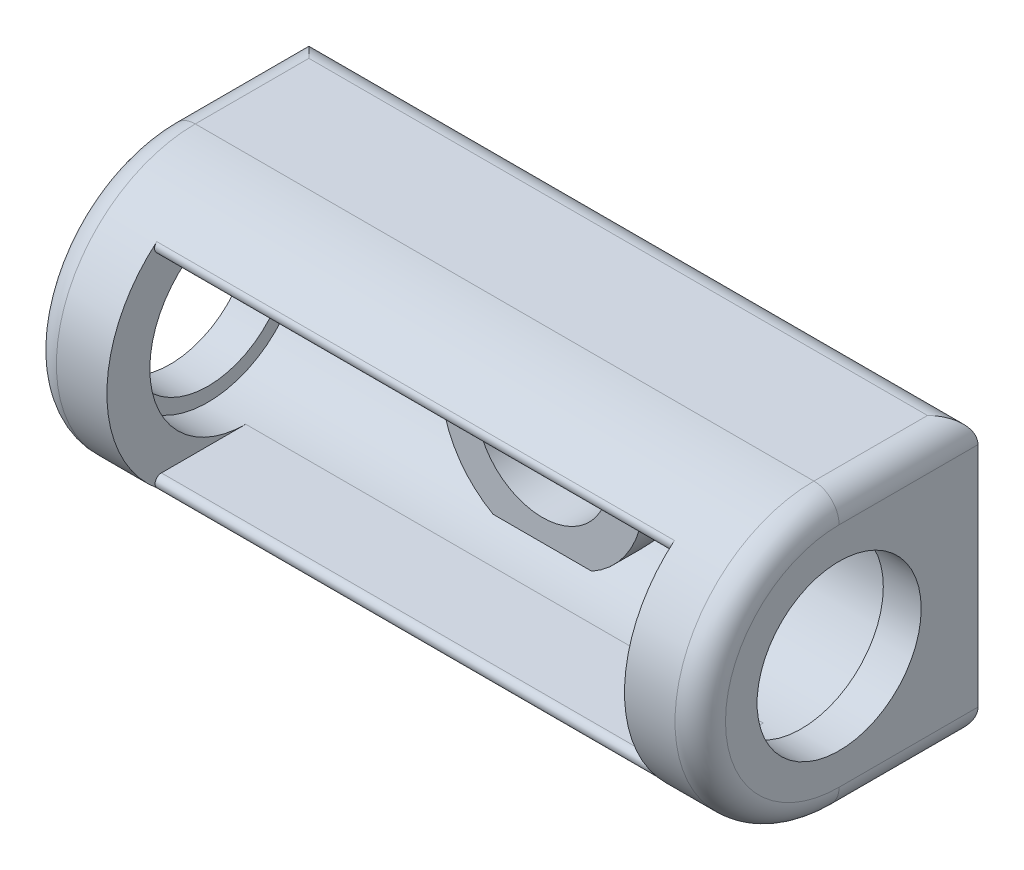
ISO-10303-21;
HEADER;
FILE_DESCRIPTION(('STEP AP214'),'2;1');
FILE_NAME('part.step','',(''),(''),'','','');
FILE_SCHEMA(('AUTOMOTIVE_DESIGN { 1 0 10303 214 1 1 1 1 }'));
ENDSEC;
DATA;
#1=APPLICATION_CONTEXT('core data for automotive mechanical design processes');
#2=APPLICATION_PROTOCOL_DEFINITION('international standard','automotive_design',2000,#1);
#3=PRODUCT_CONTEXT('',#1,'mechanical');
#4=PRODUCT('Part','Part','',(#3));
#5=PRODUCT_RELATED_PRODUCT_CATEGORY('part','',(#4));
#6=PRODUCT_DEFINITION_FORMATION('','',#4);
#7=PRODUCT_DEFINITION_CONTEXT('part definition',#1,'design');
#8=PRODUCT_DEFINITION('design','',#6,#7);
#9=PRODUCT_DEFINITION_SHAPE('','',#8);
#10=(LENGTH_UNIT() NAMED_UNIT(*) SI_UNIT(.MILLI.,.METRE.));
#11=(NAMED_UNIT(*) PLANE_ANGLE_UNIT() SI_UNIT($,.RADIAN.));
#12=(NAMED_UNIT(*) SI_UNIT($,.STERADIAN.) SOLID_ANGLE_UNIT());
#13=UNCERTAINTY_MEASURE_WITH_UNIT(LENGTH_MEASURE(1.E-05),#10,'distance_accuracy_value','');
#14=(GEOMETRIC_REPRESENTATION_CONTEXT(3) GLOBAL_UNCERTAINTY_ASSIGNED_CONTEXT((#13)) GLOBAL_UNIT_ASSIGNED_CONTEXT((#10,
#11,#12)) REPRESENTATION_CONTEXT('',''));
#15=CARTESIAN_POINT('',(0.,0.,0.));
#16=DIRECTION('',(0.,0.,1.));
#17=DIRECTION('',(1.,0.,0.));
#18=AXIS2_PLACEMENT_3D('',#15,#16,#17);
#19=CARTESIAN_POINT('',(47.,0.,0.));
#20=DIRECTION('',(-1.,0.,0.));
#21=DIRECTION('',(0.,0.,-1.));
#22=AXIS2_PLACEMENT_3D('',#19,#20,#21);
#23=PLANE('',#22);
#24=CARTESIAN_POINT('',(47.,0.,0.));
#25=DIRECTION('',(-1.,0.,0.));
#26=DIRECTION('',(0.,0.,1.));
#27=AXIS2_PLACEMENT_3D('',#24,#25,#26);
#28=CIRCLE('',#27,11.);
#29=CARTESIAN_POINT('',(47.,8.44769069068865,7.04531915490365));
#30=VERTEX_POINT('',#29);
#31=CARTESIAN_POINT('',(47.,-8.48571428571428,6.99947519898631));
#32=VERTEX_POINT('',#31);
#33=EDGE_CURVE('E414',#30,#32,#28,.F.);
#34=ORIENTED_EDGE('',*,*,#33,.F.);
#35=CARTESIAN_POINT('',(47.,8.0637047502028,6.7250773751353));
#36=DIRECTION('',(-1.,0.,0.));
#37=DIRECTION('',(0.,0.,1.));
#38=AXIS2_PLACEMENT_3D('',#35,#36,#37);
#39=CIRCLE('',#38,0.5);
#40=CARTESIAN_POINT('',(47.,7.5637047502028,6.7250773751353));
#41=VERTEX_POINT('',#40);
#42=EDGE_CURVE('E297',#30,#41,#39,.F.);
#43=ORIENTED_EDGE('',*,*,#42,.T.);
#44=DIRECTION('',(0.,0.,-1.));
#45=VECTOR('',#44,1.);
#46=CARTESIAN_POINT('',(47.,7.5637047502028,0.741869565192948));
#47=LINE('',#46,#45);
#48=CARTESIAN_POINT('',(47.,7.5637047502028,0.741869565192948));
#49=VERTEX_POINT('',#48);
#50=EDGE_CURVE('E419',#41,#49,#47,.T.);
#51=ORIENTED_EDGE('',*,*,#50,.T.);
#52=CARTESIAN_POINT('',(47.,0.,0.));
#53=DIRECTION('',(1.,0.,0.));
#54=DIRECTION('',(0.,0.,-1.));
#55=AXIS2_PLACEMENT_3D('',#52,#53,#54);
#56=CIRCLE('',#55,7.6);
#57=CARTESIAN_POINT('',(47.,-7.6,0.));
#58=VERTEX_POINT('',#57);
#59=EDGE_CURVE('E423',#49,#58,#56,.T.);
#60=ORIENTED_EDGE('',*,*,#59,.T.);
#61=DIRECTION('',(0.,0.,1.));
#62=VECTOR('',#61,1.);
#63=CARTESIAN_POINT('',(47.,-7.6,11.));
#64=LINE('',#63,#62);
#65=CARTESIAN_POINT('',(47.,-7.6,6.68131723539603));
#66=VERTEX_POINT('',#65);
#67=EDGE_CURVE('E416',#58,#66,#64,.T.);
#68=ORIENTED_EDGE('',*,*,#67,.T.);
#69=CARTESIAN_POINT('',(47.,-8.1,6.68131723539603));
#70=DIRECTION('',(-1.,0.,0.));
#71=DIRECTION('',(0.,0.,1.));
#72=AXIS2_PLACEMENT_3D('',#69,#70,#71);
#73=CIRCLE('',#72,0.5);
#74=EDGE_CURVE('E44',#66,#32,#73,.F.);
#75=ORIENTED_EDGE('',*,*,#74,.T.);
#76=EDGE_LOOP('',(#34,#43,#51,#60,#68,#75));
#77=FACE_BOUND('',#76,.T.);
#78=ADVANCED_FACE('F36',(#77),#23,.T.);
#79=CARTESIAN_POINT('',(-0.001000000000001,0.,0.));
#80=DIRECTION('',(1.,0.,0.));
#81=DIRECTION('',(0.,0.,-1.));
#82=AXIS2_PLACEMENT_3D('',#79,#80,#81);
#83=CYLINDRICAL_SURFACE('',#82,6.5);
#84=CARTESIAN_POINT('',(53.,0.,0.));
#85=DIRECTION('',(-1.,0.,0.));
#86=DIRECTION('',(0.,0.,1.));
#87=AXIS2_PLACEMENT_3D('',#84,#85,#86);
#88=CIRCLE('',#87,6.5);
#89=CARTESIAN_POINT('',(53.,0.,-6.5));
#90=VERTEX_POINT('',#89);
#91=EDGE_CURVE('E378',#90,#90,#88,.T.);
#92=CARTESIAN_POINT('',(50.,0.,0.));
#93=DIRECTION('',(-1.,0.,0.));
#94=DIRECTION('',(0.,0.,1.));
#95=AXIS2_PLACEMENT_3D('',#92,#93,#94);
#96=CIRCLE('',#95,6.5);
#97=CARTESIAN_POINT('',(50.,0.,-6.5));
#98=VERTEX_POINT('',#97);
#99=EDGE_CURVE('E375',#98,#98,#96,.T.);
#100=CARTESIAN_POINT('',(53.,0.,-6.5));
#101=CARTESIAN_POINT('',(52.96875,0.,-6.5));
#102=CARTESIAN_POINT('',(52.9375,0.,-6.5));
#103=CARTESIAN_POINT('',(52.875,0.,-6.5));
#104=CARTESIAN_POINT('',(52.84375,0.,-6.5));
#105=CARTESIAN_POINT('',(52.78125,0.,-6.5));
#106=CARTESIAN_POINT('',(52.75,0.,-6.5));
#107=CARTESIAN_POINT('',(52.6875,0.,-6.5));
#108=CARTESIAN_POINT('',(52.65625,0.,-6.5));
#109=CARTESIAN_POINT('',(52.59375,0.,-6.5));
#110=CARTESIAN_POINT('',(52.5625,0.,-6.5));
#111=CARTESIAN_POINT('',(52.5,0.,-6.5));
#112=CARTESIAN_POINT('',(52.46875,0.,-6.5));
#113=CARTESIAN_POINT('',(52.40625,0.,-6.5));
#114=CARTESIAN_POINT('',(52.375,0.,-6.5));
#115=CARTESIAN_POINT('',(52.3125,0.,-6.5));
#116=CARTESIAN_POINT('',(52.28125,0.,-6.5));
#117=CARTESIAN_POINT('',(52.21875,0.,-6.5));
#118=CARTESIAN_POINT('',(52.1875,0.,-6.5));
#119=CARTESIAN_POINT('',(52.125,0.,-6.5));
#120=CARTESIAN_POINT('',(52.09375,0.,-6.5));
#121=CARTESIAN_POINT('',(52.03125,0.,-6.5));
#122=CARTESIAN_POINT('',(52.,0.,-6.5));
#123=CARTESIAN_POINT('',(51.9375,0.,-6.5));
#124=CARTESIAN_POINT('',(51.90625,0.,-6.5));
#125=CARTESIAN_POINT('',(51.84375,0.,-6.5));
#126=CARTESIAN_POINT('',(51.8125,0.,-6.5));
#127=CARTESIAN_POINT('',(51.75,0.,-6.5));
#128=CARTESIAN_POINT('',(51.71875,0.,-6.5));
#129=CARTESIAN_POINT('',(51.65625,0.,-6.5));
#130=CARTESIAN_POINT('',(51.625,0.,-6.5));
#131=CARTESIAN_POINT('',(51.5625,0.,-6.5));
#132=CARTESIAN_POINT('',(51.53125,0.,-6.5));
#133=CARTESIAN_POINT('',(51.46875,0.,-6.5));
#134=CARTESIAN_POINT('',(51.4375,0.,-6.5));
#135=CARTESIAN_POINT('',(51.375,0.,-6.5));
#136=CARTESIAN_POINT('',(51.34375,0.,-6.5));
#137=CARTESIAN_POINT('',(51.28125,0.,-6.5));
#138=CARTESIAN_POINT('',(51.25,0.,-6.5));
#139=CARTESIAN_POINT('',(51.1875,0.,-6.5));
#140=CARTESIAN_POINT('',(51.15625,0.,-6.5));
#141=CARTESIAN_POINT('',(51.09375,0.,-6.5));
#142=CARTESIAN_POINT('',(51.0625,0.,-6.5));
#143=CARTESIAN_POINT('',(51.,0.,-6.5));
#144=CARTESIAN_POINT('',(50.96875,0.,-6.5));
#145=CARTESIAN_POINT('',(50.90625,0.,-6.5));
#146=CARTESIAN_POINT('',(50.875,0.,-6.5));
#147=CARTESIAN_POINT('',(50.8125,0.,-6.5));
#148=CARTESIAN_POINT('',(50.78125,0.,-6.5));
#149=CARTESIAN_POINT('',(50.71875,0.,-6.5));
#150=CARTESIAN_POINT('',(50.6875,0.,-6.5));
#151=CARTESIAN_POINT('',(50.625,0.,-6.5));
#152=CARTESIAN_POINT('',(50.59375,0.,-6.5));
#153=CARTESIAN_POINT('',(50.53125,0.,-6.5));
#154=CARTESIAN_POINT('',(50.5,0.,-6.5));
#155=CARTESIAN_POINT('',(50.4375,0.,-6.5));
#156=CARTESIAN_POINT('',(50.40625,0.,-6.5));
#157=CARTESIAN_POINT('',(50.34375,0.,-6.5));
#158=CARTESIAN_POINT('',(50.3125,0.,-6.5));
#159=CARTESIAN_POINT('',(50.25,0.,-6.5));
#160=CARTESIAN_POINT('',(50.21875,0.,-6.5));
#161=CARTESIAN_POINT('',(50.15625,0.,-6.5));
#162=CARTESIAN_POINT('',(50.125,0.,-6.5));
#163=CARTESIAN_POINT('',(50.0625,0.,-6.5));
#164=CARTESIAN_POINT('',(50.03125,0.,-6.5));
#165=CARTESIAN_POINT('',(50.,0.,-6.5));
#166=B_SPLINE_CURVE_WITH_KNOTS('',3,(#100,#101,#102,#103,#104,#105,#106,#107,#108,#109,#110,
#111,#112,#113,#114,#115,#116,#117,#118,#119,#120,#121,#122,#123,#124,#125,#126,#127,#128,#129,
#130,#131,#132,#133,#134,#135,#136,#137,#138,#139,#140,#141,#142,#143,#144,#145,#146,#147,#148,
#149,#150,#151,#152,#153,#154,#155,#156,#157,#158,#159,#160,#161,#162,#163,#164,#165),
.UNSPECIFIED.,.F.,.F.,(4,2,2,2,2,2,2,2,2,2,2,2,2,2,2,2,2,2,2,2,2,2,2,2,2,2,2,2,2,2,2,2,4),(0.,
0.0937499999999966,0.1875,0.281249999999997,0.375,0.468749999999997,0.5625,0.656249999999997,
0.750000000000001,0.843749999999997,0.937499999999994,1.03125,1.12499999999999,1.21875,
1.31249999999999,1.40625,1.49999999999999,1.59374999999999,1.68749999999999,1.78124999999999,
1.87499999999999,1.96874999999999,2.06249999999999,2.15624999999999,2.24999999999999,
2.34374999999999,2.43749999999999,2.53124999999999,2.62499999999999,2.71874999999999,
2.81249999999999,2.90624999999999,2.99999999999999),.UNSPECIFIED.);
#167=EDGE_CURVE('BSEAM204',#90,#98,#166,.T.);
#168=ORIENTED_EDGE('',*,*,#91,.F.);
#169=ORIENTED_EDGE('',*,*,#99,.T.);
#170=ORIENTED_EDGE('',*,*,#167,.T.);
#171=ORIENTED_EDGE('',*,*,#167,.F.);
#172=EDGE_LOOP('',(#168,#170,#169,#171));
#173=FACE_BOUND('',#172,.T.);
#174=ADVANCED_FACE('F204',(#173),#83,.F.);
#175=CARTESIAN_POINT('',(53.,0.,0.));
#176=DIRECTION('',(-1.,0.,0.));
#177=DIRECTION('',(0.,0.,-1.));
#178=AXIS2_PLACEMENT_3D('',#175,#176,#177);
#179=PLANE('',#178);
#180=DIRECTION('',(0.,1.,0.));
#181=VECTOR('',#180,1.);
#182=CARTESIAN_POINT('',(53.,11.,-11.));
#183=LINE('',#182,#181);
#184=CARTESIAN_POINT('',(53.,-9.,-11.));
#185=VERTEX_POINT('',#184);
#186=CARTESIAN_POINT('',(53.,9.,-11.));
#187=VERTEX_POINT('',#186);
#188=EDGE_CURVE('E409',#185,#187,#183,.T.);
#189=ORIENTED_EDGE('',*,*,#188,.T.);
#190=DIRECTION('',(0.,0.,1.));
#191=VECTOR('',#190,1.);
#192=CARTESIAN_POINT('',(53.,9.,0.));
#193=LINE('',#192,#191);
#194=CARTESIAN_POINT('',(53.,9.,0.));
#195=VERTEX_POINT('',#194);
#196=EDGE_CURVE('E367',#187,#195,#193,.T.);
#197=ORIENTED_EDGE('',*,*,#196,.T.);
#198=CARTESIAN_POINT('',(53.,0.,0.));
#199=DIRECTION('',(-1.,0.,0.));
#200=DIRECTION('',(0.,0.,1.));
#201=AXIS2_PLACEMENT_3D('',#198,#199,#200);
#202=CIRCLE('',#201,9.);
#203=CARTESIAN_POINT('',(53.,-9.,0.));
#204=VERTEX_POINT('',#203);
#205=EDGE_CURVE('E372',#195,#204,#202,.F.);
#206=ORIENTED_EDGE('',*,*,#205,.T.);
#207=DIRECTION('',(0.,0.,-1.));
#208=VECTOR('',#207,1.);
#209=CARTESIAN_POINT('',(53.,-9.,0.));
#210=LINE('',#209,#208);
#211=EDGE_CURVE('E370',#204,#185,#210,.T.);
#212=ORIENTED_EDGE('',*,*,#211,.T.);
#213=EDGE_LOOP('',(#189,#197,#206,#212));
#214=FACE_BOUND('',#213,.T.);
#215=ORIENTED_EDGE('',*,*,#91,.T.);
#216=EDGE_LOOP('',(#215));
#217=FACE_BOUND('',#216,.T.);
#218=ADVANCED_FACE('F210',(#214,#217),#179,.F.);
#219=CARTESIAN_POINT('',(26.5,0.,0.));
#220=DIRECTION('',(-1.,0.,0.));
#221=DIRECTION('',(0.,0.,1.));
#222=AXIS2_PLACEMENT_3D('',#219,#220,#221);
#223=CYLINDRICAL_SURFACE('',#222,11.);
#224=DIRECTION('',(-1.,0.,0.));
#225=VECTOR('',#224,1.);
#226=CARTESIAN_POINT('',(26.5,-11.,0.));
#227=LINE('',#226,#225);
#228=CARTESIAN_POINT('',(51.,-11.,0.));
#229=VERTEX_POINT('',#228);
#230=CARTESIAN_POINT('',(2.,-11.,0.));
#231=VERTEX_POINT('',#230);
#232=EDGE_CURVE('E387',#229,#231,#227,.T.);
#233=ORIENTED_EDGE('',*,*,#232,.F.);
#234=CARTESIAN_POINT('',(51.,0.,0.));
#235=DIRECTION('',(-1.,0.,0.));
#236=DIRECTION('',(0.,0.,1.));
#237=AXIS2_PLACEMENT_3D('',#234,#235,#236);
#238=CIRCLE('',#237,11.);
#239=CARTESIAN_POINT('',(51.,11.,0.));
#240=VERTEX_POINT('',#239);
#241=EDGE_CURVE('E315',#229,#240,#238,.T.);
#242=ORIENTED_EDGE('',*,*,#241,.T.);
#243=DIRECTION('',(-1.,0.,0.));
#244=VECTOR('',#243,1.);
#245=CARTESIAN_POINT('',(26.5,11.,0.));
#246=LINE('',#245,#244);
#247=CARTESIAN_POINT('',(2.,11.,0.));
#248=VERTEX_POINT('',#247);
#249=EDGE_CURVE('E374',#240,#248,#246,.T.);
#250=ORIENTED_EDGE('',*,*,#249,.T.);
#251=CARTESIAN_POINT('',(2.,0.,0.));
#252=DIRECTION('',(1.,0.,0.));
#253=DIRECTION('',(0.,0.,-1.));
#254=AXIS2_PLACEMENT_3D('',#251,#252,#253);
#255=CIRCLE('',#254,11.);
#256=EDGE_CURVE('E340',#248,#231,#255,.T.);
#257=ORIENTED_EDGE('',*,*,#256,.T.);
#258=EDGE_LOOP('',(#233,#242,#250,#257));
#259=FACE_BOUND('',#258,.T.);
#260=CARTESIAN_POINT('',(6.,0.,0.));
#261=DIRECTION('',(1.,0.,0.));
#262=DIRECTION('',(0.,0.,-1.));
#263=AXIS2_PLACEMENT_3D('',#260,#261,#262);
#264=CIRCLE('',#263,11.);
#265=CARTESIAN_POINT('',(6.,-8.48571428571428,6.99947519898631));
#266=VERTEX_POINT('',#265);
#267=CARTESIAN_POINT('',(6.,8.44769069068865,7.04531915490365));
#268=VERTEX_POINT('',#267);
#269=EDGE_CURVE('E393',#266,#268,#264,.F.);
#270=ORIENTED_EDGE('',*,*,#269,.T.);
#271=DIRECTION('',(-1.,0.,0.));
#272=VECTOR('',#271,1.);
#273=CARTESIAN_POINT('',(26.5,8.44769069068865,7.04531915490365));
#274=LINE('',#273,#272);
#275=EDGE_CURVE('E299',#268,#30,#274,.F.);
#276=ORIENTED_EDGE('',*,*,#275,.T.);
#277=ORIENTED_EDGE('',*,*,#33,.T.);
#278=DIRECTION('',(-1.,0.,0.));
#279=VECTOR('',#278,1.);
#280=CARTESIAN_POINT('',(26.5,-8.48571428571428,6.99947519898631));
#281=LINE('',#280,#279);
#282=EDGE_CURVE('E311',#32,#266,#281,.T.);
#283=ORIENTED_EDGE('',*,*,#282,.T.);
#284=EDGE_LOOP('',(#270,#276,#277,#283));
#285=FACE_BOUND('',#284,.T.);
#286=ADVANCED_FACE('F216',(#259,#285),#223,.T.);
#287=CARTESIAN_POINT('',(26.501,0.,0.));
#288=DIRECTION('',(-1.,0.,0.));
#289=DIRECTION('',(0.,0.,1.));
#290=AXIS2_PLACEMENT_3D('',#287,#288,#289);
#291=CYLINDRICAL_SURFACE('',#290,6.5);
#292=CARTESIAN_POINT('',(0.,0.,0.));
#293=DIRECTION('',(-1.,0.,0.));
#294=DIRECTION('',(0.,0.,1.));
#295=AXIS2_PLACEMENT_3D('',#292,#293,#294);
#296=CIRCLE('',#295,6.5);
#297=CARTESIAN_POINT('',(0.,0.,6.5));
#298=VERTEX_POINT('',#297);
#299=EDGE_CURVE('E383',#298,#298,#296,.T.);
#300=ORIENTED_EDGE('',*,*,#299,.T.);
#301=EDGE_LOOP('',(#300));
#302=FACE_BOUND('',#301,.T.);
#303=CARTESIAN_POINT('',(3.,0.,0.));
#304=DIRECTION('',(1.,0.,0.));
#305=DIRECTION('',(0.,0.,-1.));
#306=AXIS2_PLACEMENT_3D('',#303,#304,#305);
#307=CIRCLE('',#306,6.5);
#308=CARTESIAN_POINT('',(3.,0.,-6.5));
#309=VERTEX_POINT('',#308);
#310=EDGE_CURVE('E380',#309,#309,#307,.F.);
#311=ORIENTED_EDGE('',*,*,#310,.F.);
#312=EDGE_LOOP('',(#311));
#313=FACE_BOUND('',#312,.T.);
#314=ADVANCED_FACE('F221',(#302,#313),#291,.F.);
#315=CARTESIAN_POINT('',(26.5,-11.,-11.));
#316=DIRECTION('',(0.,1.,0.));
#317=DIRECTION('',(0.,0.,1.));
#318=AXIS2_PLACEMENT_3D('',#315,#316,#317);
#319=PLANE('',#318);
#320=DIRECTION('',(-1.,0.,0.));
#321=VECTOR('',#320,1.);
#322=CARTESIAN_POINT('',(26.5,-11.,-9.));
#323=LINE('',#322,#321);
#324=CARTESIAN_POINT('',(2.,-11.,-9.));
#325=VERTEX_POINT('',#324);
#326=CARTESIAN_POINT('',(51.,-11.,-9.));
#327=VERTEX_POINT('',#326);
#328=EDGE_CURVE('E357',#325,#327,#323,.F.);
#329=ORIENTED_EDGE('',*,*,#328,.T.);
#330=DIRECTION('',(0.,0.,-1.));
#331=VECTOR('',#330,1.);
#332=CARTESIAN_POINT('',(51.,-11.,-11.));
#333=LINE('',#332,#331);
#334=EDGE_CURVE('E353',#327,#229,#333,.F.);
#335=ORIENTED_EDGE('',*,*,#334,.T.);
#336=ORIENTED_EDGE('',*,*,#232,.T.);
#337=DIRECTION('',(0.,0.,-1.));
#338=VECTOR('',#337,1.);
#339=CARTESIAN_POINT('',(2.,-11.,-11.));
#340=LINE('',#339,#338);
#341=EDGE_CURVE('E355',#231,#325,#340,.T.);
#342=ORIENTED_EDGE('',*,*,#341,.T.);
#343=EDGE_LOOP('',(#329,#335,#336,#342));
#344=FACE_BOUND('',#343,.T.);
#345=ADVANCED_FACE('F224',(#344),#319,.F.);
#346=CARTESIAN_POINT('',(26.5,11.,-11.));
#347=DIRECTION('',(0.,0.,1.));
#348=DIRECTION('',(1.,0.,0.));
#349=AXIS2_PLACEMENT_3D('',#346,#347,#348);
#350=PLANE('',#349);
#351=CARTESIAN_POINT('',(26.5,0.,-11.));
#352=DIRECTION('',(0.,0.,1.));
#353=DIRECTION('',(1.,0.,0.));
#354=AXIS2_PLACEMENT_3D('',#351,#352,#353);
#355=CIRCLE('',#354,5.25);
#356=CARTESIAN_POINT('',(31.75,0.,-11.));
#357=VERTEX_POINT('',#356);
#358=EDGE_CURVE('E156',#357,#357,#355,.F.);
#359=ORIENTED_EDGE('',*,*,#358,.F.);
#360=EDGE_LOOP('',(#359));
#361=FACE_BOUND('',#360,.T.);
#362=DIRECTION('',(0.,1.,0.));
#363=VECTOR('',#362,1.);
#364=CARTESIAN_POINT('',(0.,11.,-11.));
#365=LINE('',#364,#363);
#366=CARTESIAN_POINT('',(0.,-9.,-11.));
#367=VERTEX_POINT('',#366);
#368=CARTESIAN_POINT('',(0.,9.,-11.));
#369=VERTEX_POINT('',#368);
#370=EDGE_CURVE('E390',#367,#369,#365,.T.);
#371=ORIENTED_EDGE('',*,*,#370,.T.);
#372=DIRECTION('',(-1.,0.,0.));
#373=VECTOR('',#372,1.);
#374=CARTESIAN_POINT('',(26.5,9.,-11.));
#375=LINE('',#374,#373);
#376=EDGE_CURVE('E342',#369,#187,#375,.F.);
#377=ORIENTED_EDGE('',*,*,#376,.T.);
#378=ORIENTED_EDGE('',*,*,#188,.F.);
#379=DIRECTION('',(-1.,0.,0.));
#380=VECTOR('',#379,1.);
#381=CARTESIAN_POINT('',(26.5,-9.,-11.));
#382=LINE('',#381,#380);
#383=EDGE_CURVE('E344',#185,#367,#382,.T.);
#384=ORIENTED_EDGE('',*,*,#383,.T.);
#385=EDGE_LOOP('',(#371,#377,#378,#384));
#386=FACE_BOUND('',#385,.T.);
#387=ADVANCED_FACE('F249',(#361,#386),#350,.F.);
#388=CARTESIAN_POINT('',(26.5,11.,0.));
#389=DIRECTION('',(0.,-1.,0.));
#390=DIRECTION('',(0.,0.,-1.));
#391=AXIS2_PLACEMENT_3D('',#388,#389,#390);
#392=PLANE('',#391);
#393=ORIENTED_EDGE('',*,*,#249,.F.);
#394=DIRECTION('',(0.,0.,1.));
#395=VECTOR('',#394,1.);
#396=CARTESIAN_POINT('',(51.,11.,0.));
#397=LINE('',#396,#395);
#398=CARTESIAN_POINT('',(51.,11.,-9.));
#399=VERTEX_POINT('',#398);
#400=EDGE_CURVE('E360',#240,#399,#397,.F.);
#401=ORIENTED_EDGE('',*,*,#400,.T.);
#402=DIRECTION('',(-1.,0.,0.));
#403=VECTOR('',#402,1.);
#404=CARTESIAN_POINT('',(26.5,11.,-9.));
#405=LINE('',#404,#403);
#406=CARTESIAN_POINT('',(2.,11.,-9.));
#407=VERTEX_POINT('',#406);
#408=EDGE_CURVE('E365',#399,#407,#405,.T.);
#409=ORIENTED_EDGE('',*,*,#408,.T.);
#410=DIRECTION('',(0.,0.,1.));
#411=VECTOR('',#410,1.);
#412=CARTESIAN_POINT('',(2.,11.,0.));
#413=LINE('',#412,#411);
#414=EDGE_CURVE('E363',#407,#248,#413,.T.);
#415=ORIENTED_EDGE('',*,*,#414,.T.);
#416=EDGE_LOOP('',(#393,#401,#409,#415));
#417=FACE_BOUND('',#416,.T.);
#418=ADVANCED_FACE('F242',(#417),#392,.F.);
#419=CARTESIAN_POINT('',(0.,0.,0.));
#420=DIRECTION('',(1.,0.,0.));
#421=DIRECTION('',(0.,0.,-1.));
#422=AXIS2_PLACEMENT_3D('',#419,#420,#421);
#423=PLANE('',#422);
#424=ORIENTED_EDGE('',*,*,#299,.F.);
#425=EDGE_LOOP('',(#424));
#426=FACE_BOUND('',#425,.T.);
#427=CARTESIAN_POINT('',(0.,0.,0.));
#428=DIRECTION('',(1.,0.,0.));
#429=DIRECTION('',(0.,0.,-1.));
#430=AXIS2_PLACEMENT_3D('',#427,#428,#429);
#431=CIRCLE('',#430,9.);
#432=CARTESIAN_POINT('',(0.,-9.,0.));
#433=VERTEX_POINT('',#432);
#434=CARTESIAN_POINT('',(0.,9.,0.));
#435=VERTEX_POINT('',#434);
#436=EDGE_CURVE('E351',#433,#435,#431,.F.);
#437=ORIENTED_EDGE('',*,*,#436,.T.);
#438=DIRECTION('',(0.,0.,1.));
#439=VECTOR('',#438,1.);
#440=CARTESIAN_POINT('',(0.,9.,0.));
#441=LINE('',#440,#439);
#442=EDGE_CURVE('E347',#435,#369,#441,.F.);
#443=ORIENTED_EDGE('',*,*,#442,.T.);
#444=ORIENTED_EDGE('',*,*,#370,.F.);
#445=DIRECTION('',(0.,0.,-1.));
#446=VECTOR('',#445,1.);
#447=CARTESIAN_POINT('',(0.,-9.,0.));
#448=LINE('',#447,#446);
#449=EDGE_CURVE('E349',#367,#433,#448,.F.);
#450=ORIENTED_EDGE('',*,*,#449,.T.);
#451=EDGE_LOOP('',(#437,#443,#444,#450));
#452=FACE_BOUND('',#451,.T.);
#453=ADVANCED_FACE('F233',(#426,#452),#423,.F.);
#454=CARTESIAN_POINT('',(26.501,7.5637047502028,0.741869565192948));
#455=DIRECTION('',(0.,1.,0.));
#456=DIRECTION('',(0.,0.,1.));
#457=AXIS2_PLACEMENT_3D('',#454,#455,#456);
#458=PLANE('',#457);
#459=ORIENTED_EDGE('',*,*,#50,.F.);
#460=DIRECTION('',(-1.,0.,0.));
#461=VECTOR('',#460,1.);
#462=CARTESIAN_POINT('',(26.501,7.5637047502028,6.7250773751353));
#463=LINE('',#462,#461);
#464=CARTESIAN_POINT('',(6.,7.5637047502028,6.7250773751353));
#465=VERTEX_POINT('',#464);
#466=EDGE_CURVE('E301',#41,#465,#463,.T.);
#467=ORIENTED_EDGE('',*,*,#466,.T.);
#468=DIRECTION('',(0.,0.,-1.));
#469=VECTOR('',#468,1.);
#470=CARTESIAN_POINT('',(6.,7.5637047502028,0.741869565192948));
#471=LINE('',#470,#469);
#472=CARTESIAN_POINT('',(6.,7.5637047502028,0.741869565192949));
#473=VERTEX_POINT('',#472);
#474=EDGE_CURVE('E399',#465,#473,#471,.T.);
#475=ORIENTED_EDGE('',*,*,#474,.T.);
#476=DIRECTION('',(-1.,0.,0.));
#477=VECTOR('',#476,1.);
#478=CARTESIAN_POINT('',(26.501,7.5637047502028,0.741869565192948));
#479=LINE('',#478,#477);
#480=EDGE_CURVE('E395',#49,#473,#479,.T.);
#481=ORIENTED_EDGE('',*,*,#480,.F.);
#482=EDGE_LOOP('',(#459,#467,#475,#481));
#483=FACE_BOUND('',#482,.T.);
#484=ADVANCED_FACE('F230',(#483),#458,.F.);
#485=CARTESIAN_POINT('',(26.501,-7.6,11.));
#486=DIRECTION('',(0.,-1.,0.));
#487=DIRECTION('',(0.,0.,-1.));
#488=AXIS2_PLACEMENT_3D('',#485,#486,#487);
#489=PLANE('',#488);
#490=DIRECTION('',(0.,0.,1.));
#491=VECTOR('',#490,1.);
#492=CARTESIAN_POINT('',(6.,-7.6,11.));
#493=LINE('',#492,#491);
#494=CARTESIAN_POINT('',(6.,-7.6,0.));
#495=VERTEX_POINT('',#494);
#496=CARTESIAN_POINT('',(6.,-7.6,6.68131723539603));
#497=VERTEX_POINT('',#496);
#498=EDGE_CURVE('E403',#495,#497,#493,.T.);
#499=ORIENTED_EDGE('',*,*,#498,.T.);
#500=DIRECTION('',(-1.,0.,0.));
#501=VECTOR('',#500,1.);
#502=CARTESIAN_POINT('',(26.501,-7.6,6.68131723539603));
#503=LINE('',#502,#501);
#504=EDGE_CURVE('E306',#497,#66,#503,.F.);
#505=ORIENTED_EDGE('',*,*,#504,.T.);
#506=ORIENTED_EDGE('',*,*,#67,.F.);
#507=DIRECTION('',(-1.,0.,0.));
#508=VECTOR('',#507,1.);
#509=CARTESIAN_POINT('',(26.501,-7.6,0.));
#510=LINE('',#509,#508);
#511=EDGE_CURVE('E396',#58,#495,#510,.T.);
#512=ORIENTED_EDGE('',*,*,#511,.T.);
#513=EDGE_LOOP('',(#499,#505,#506,#512));
#514=FACE_BOUND('',#513,.T.);
#515=ADVANCED_FACE('F229',(#514),#489,.F.);
#516=CARTESIAN_POINT('',(6.,0.,0.));
#517=DIRECTION('',(1.,0.,0.));
#518=DIRECTION('',(0.,0.,-1.));
#519=AXIS2_PLACEMENT_3D('',#516,#517,#518);
#520=PLANE('',#519);
#521=CARTESIAN_POINT('',(6.,0.,0.));
#522=DIRECTION('',(1.,0.,0.));
#523=DIRECTION('',(0.,0.,-1.));
#524=AXIS2_PLACEMENT_3D('',#521,#522,#523);
#525=CIRCLE('',#524,7.6);
#526=EDGE_CURVE('E407',#473,#495,#525,.T.);
#527=ORIENTED_EDGE('',*,*,#526,.F.);
#528=ORIENTED_EDGE('',*,*,#474,.F.);
#529=CARTESIAN_POINT('',(6.,8.0637047502028,6.7250773751353));
#530=DIRECTION('',(1.,0.,0.));
#531=DIRECTION('',(0.,0.,-1.));
#532=AXIS2_PLACEMENT_3D('',#529,#530,#531);
#533=CIRCLE('',#532,0.5);
#534=EDGE_CURVE('E303',#465,#268,#533,.F.);
#535=ORIENTED_EDGE('',*,*,#534,.T.);
#536=ORIENTED_EDGE('',*,*,#269,.F.);
#537=CARTESIAN_POINT('',(6.,-8.1,6.68131723539603));
#538=DIRECTION('',(1.,0.,0.));
#539=DIRECTION('',(0.,0.,-1.));
#540=AXIS2_PLACEMENT_3D('',#537,#538,#539);
#541=CIRCLE('',#540,0.5);
#542=EDGE_CURVE('E12',#266,#497,#541,.F.);
#543=ORIENTED_EDGE('',*,*,#542,.T.);
#544=ORIENTED_EDGE('',*,*,#498,.F.);
#545=EDGE_LOOP('',(#527,#528,#535,#536,#543,#544));
#546=FACE_BOUND('',#545,.T.);
#547=ADVANCED_FACE('F226',(#546),#520,.T.);
#548=CARTESIAN_POINT('',(26.501,0.,0.));
#549=DIRECTION('',(-1.,0.,0.));
#550=DIRECTION('',(0.,0.,1.));
#551=AXIS2_PLACEMENT_3D('',#548,#549,#550);
#552=CYLINDRICAL_SURFACE('',#551,7.6);
#553=DIRECTION('',(-1.,0.,0.));
#554=VECTOR('',#553,1.);
#555=CARTESIAN_POINT('',(26.501,6.98283610003844,-3.));
#556=LINE('',#555,#554);
#557=CARTESIAN_POINT('',(30.4038442591886,6.98283610003844,-3.));
#558=VERTEX_POINT('',#557);
#559=CARTESIAN_POINT('',(22.5961557408114,6.98283610003844,-3.));
#560=VERTEX_POINT('',#559);
#561=EDGE_CURVE('E168',#558,#560,#556,.T.);
#562=ORIENTED_EDGE('',*,*,#561,.F.);
#563=CARTESIAN_POINT('',(30.4038442591886,-6.98283610003844,-3.));
#564=CARTESIAN_POINT('',(30.4963955885197,-6.93110774122628,-3.12035932175918));
#565=CARTESIAN_POINT('',(30.5897040105684,-6.87651467166229,-3.23889225023912));
#566=CARTESIAN_POINT('',(30.7770769160868,-6.7615561934966,-3.47251766720955));
#567=CARTESIAN_POINT('',(30.8711414159508,-6.70119065941889,-3.58761008084218));
#568=CARTESIAN_POINT('',(31.0594482583015,-6.574522812454,-3.81478357190871));
#569=CARTESIAN_POINT('',(31.1536905887401,-6.50820911747478,-3.92685831840325));
#570=CARTESIAN_POINT('',(31.3415756331093,-6.36967577819808,-4.14779836902264));
#571=CARTESIAN_POINT('',(31.4352183498554,-6.29745616165229,-4.25666368822518));
#572=CARTESIAN_POINT('',(31.716571536045,-6.07008671377367,-4.58086298614538));
#573=CARTESIAN_POINT('',(31.9025804813839,-5.90563467232587,-4.79126354919287));
#574=CARTESIAN_POINT('',(32.2658976315125,-5.55146341818696,-5.1974752850121));
#575=CARTESIAN_POINT('',(32.4432138293998,-5.36176803689741,-5.39329994979911));
#576=CARTESIAN_POINT('',(32.7267048930938,-5.02578863859697,-5.70389033603081));
#577=CARTESIAN_POINT('',(32.8364389437833,-4.88689972636118,-5.82344051283998));
#578=CARTESIAN_POINT('',(33.0493097214898,-4.59769205931687,-6.05437572848967));
#579=CARTESIAN_POINT('',(33.1524466260089,-4.44737361226868,-6.16576098702647));
#580=CARTESIAN_POINT('',(33.3504090336546,-4.13591768694629,-6.37884386961008));
#581=CARTESIAN_POINT('',(33.445265023479,-3.97482411640519,-6.48057715948088));
#582=CARTESIAN_POINT('',(33.6256750921704,-3.64151649238906,-6.67356119081156));
#583=CARTESIAN_POINT('',(33.7112309273814,-3.46930454845626,-6.76481391172263));
#584=CARTESIAN_POINT('',(33.8568848798991,-3.14668085271517,-6.91985003207228));
#585=CARTESIAN_POINT('',(33.9187794399251,-2.9980266326031,-6.98560724943253));
#586=CARTESIAN_POINT('',(34.0344692887605,-2.69410411634007,-7.1083505886562));
#587=CARTESIAN_POINT('',(34.0882662937356,-2.53883723062745,-7.16533856909631));
#588=CARTESIAN_POINT('',(34.1869261867392,-2.22230703740851,-7.26974041465056));
#589=CARTESIAN_POINT('',(34.2317875112199,-2.06104268632561,-7.31715260423193));
#590=CARTESIAN_POINT('',(34.3117612859964,-1.73343893684161,-7.40160784668432));
#591=CARTESIAN_POINT('',(34.3468736506336,-1.56709949386287,-7.43865080844696));
#592=CARTESIAN_POINT('',(34.4068390624891,-1.22942278168987,-7.50188011428887));
#593=CARTESIAN_POINT('',(34.4316264227939,-1.05806072068483,-7.52799695161015));
#594=CARTESIAN_POINT('',(34.470083171185,-0.712710859386154,-7.56850489521629));
#595=CARTESIAN_POINT('',(34.4837525258082,-0.538723051191122,-7.58289596620887));
#596=CARTESIAN_POINT('',(34.4996571755702,-0.18970973836268,-7.59963958230592));
#597=CARTESIAN_POINT('',(34.5018966688006,-0.0146846383687364,-7.60199654743611));
#598=CARTESIAN_POINT('',(34.4948992726732,0.334871470757499,-7.59463072288731));
#599=CARTESIAN_POINT('',(34.4856632576285,0.509402516516144,-7.58490885348848));
#600=CARTESIAN_POINT('',(34.4574896218302,0.838263850633088,-7.55524055540836));
#601=CARTESIAN_POINT('',(34.4396670016139,0.992798743191753,-7.53646909891287));
#602=CARTESIAN_POINT('',(34.3953103921733,1.2992507635715,-7.48972499878632));
#603=CARTESIAN_POINT('',(34.3687735454821,1.45116701549781,-7.46174933701439));
#604=CARTESIAN_POINT('',(34.3074425771139,1.75137074139016,-7.39704442039713));
#605=CARTESIAN_POINT('',(34.2726509278679,1.89965928726392,-7.36031778657848));
#606=CARTESIAN_POINT('',(34.1953484387423,2.19191689087248,-7.27863724458077));
#607=CARTESIAN_POINT('',(34.152834680771,2.33588429165196,-7.23368022618771));
#608=CARTESIAN_POINT('',(34.009933908481,2.77460266492881,-7.08239028630625));
#609=CARTESIAN_POINT('',(33.8973277358415,3.06101605145018,-6.96294162844836));
#610=CARTESIAN_POINT('',(33.6465091130227,3.60807759112665,-6.69587201813514));
#611=CARTESIAN_POINT('',(33.5082843513189,3.86871326353552,-6.54823751938051));
#612=CARTESIAN_POINT('',(33.2454688941343,4.30677070068856,-6.26604764076439));
#613=CARTESIAN_POINT('',(33.1248954009205,4.48965918892086,-6.13611928360758));
#614=CARTESIAN_POINT('',(32.8740249978764,4.83922437054597,-5.86437785344124));
#615=CARTESIAN_POINT('',(32.7437268065565,5.00589892062841,-5.72256321379154));
#616=CARTESIAN_POINT('',(32.4750983198388,5.32368543578285,-5.42820750090306));
#617=CARTESIAN_POINT('',(32.3367446619917,5.47474820888144,-5.27563492685323));
#618=CARTESIAN_POINT('',(32.0543125493963,5.76107911324707,-4.96136582471503));
#619=CARTESIAN_POINT('',(31.9102352798924,5.8963504919771,-4.79967118273929));
#620=CARTESIAN_POINT('',(31.652393741887,6.12167456145599,-4.50674984384448));
#621=CARTESIAN_POINT('',(31.5394240582914,6.21490212338727,-4.37724585540527));
#622=CARTESIAN_POINT('',(31.3121133092736,6.39252471660942,-4.11350137289422));
#623=CARTESIAN_POINT('',(31.1977723993659,6.47692073914597,-3.97926141265085));
#624=CARTESIAN_POINT('',(30.9695536441974,6.63643637893237,-3.70708139835458));
#625=CARTESIAN_POINT('',(30.8556788699356,6.71162153401785,-3.56917715544822));
#626=CARTESIAN_POINT('',(30.6287946807694,6.85354372751214,-3.28839467574674));
#627=CARTESIAN_POINT('',(30.5157852880695,6.92028054982701,-3.14551631184123));
#628=CARTESIAN_POINT('',(30.4038442591886,6.98283610003844,-3.));
#629=B_SPLINE_CURVE_WITH_KNOTS('',3,(#563,#564,#565,#566,#567,#568,#569,#570,#571,#572,#573,
#574,#575,#576,#577,#578,#579,#580,#581,#582,#583,#584,#585,#586,#587,#588,#589,#590,#591,#592,
#593,#594,#595,#596,#597,#598,#599,#600,#601,#602,#603,#604,#605,#606,#607,#608,#609,#610,#611,
#612,#613,#614,#615,#616,#617,#618,#619,#620,#621,#622,#623,#624,#625,#626,#627,#628),
.UNSPECIFIED.,.F.,.F.,(4,2,2,2,2,2,2,2,2,2,2,2,2,2,2,2,2,2,2,2,2,2,2,2,2,2,2,2,2,2,2,2,4),(0.,
0.481145590312224,0.962301641660523,1.44439889394958,1.92649388101368,2.90144070223173,
3.875473553096,4.51577587825356,5.15606096824572,5.79387955101392,6.43157747104124,
6.95289035333832,7.47409259448591,7.99538595461368,8.51668389489973,9.04124942926206,
9.56581654245872,10.0901909727059,10.6145254535855,11.0840524149716,11.553733492133,
12.023274070319,12.4929924527735,13.4793981118982,14.4662790429095,15.2293480505643,
15.9925177911559,16.7580232816834,17.5233710694542,18.1096536221094,18.6958703000892,
19.2776381936774,19.8594209648912),.UNSPECIFIED.);
#630=CARTESIAN_POINT('',(30.4038442591886,-6.98283610003844,-3.));
#631=VERTEX_POINT('',#630);
#632=EDGE_CURVE('E152',#631,#558,#629,.T.);
#633=ORIENTED_EDGE('',*,*,#632,.F.);
#634=DIRECTION('',(-1.,0.,0.));
#635=VECTOR('',#634,1.);
#636=CARTESIAN_POINT('',(26.501,-6.98283610003844,-3.));
#637=LINE('',#636,#635);
#638=CARTESIAN_POINT('',(22.5961557408114,-6.98283610003844,-3.));
#639=VERTEX_POINT('',#638);
#640=EDGE_CURVE('E160',#639,#631,#637,.F.);
#641=ORIENTED_EDGE('',*,*,#640,.F.);
#642=CARTESIAN_POINT('',(22.5961557408114,6.98283610003844,-3.));
#643=CARTESIAN_POINT('',(22.5036044114803,6.93110774122628,-3.12035932175918));
#644=CARTESIAN_POINT('',(22.4102959894316,6.87651467166229,-3.23889225023912));
#645=CARTESIAN_POINT('',(22.2229230839132,6.7615561934966,-3.47251766720955));
#646=CARTESIAN_POINT('',(22.1288585840492,6.70119065941889,-3.58761008084218));
#647=CARTESIAN_POINT('',(21.9405517416985,6.574522812454,-3.81478357190871));
#648=CARTESIAN_POINT('',(21.8463094112599,6.50820911747478,-3.92685831840325));
#649=CARTESIAN_POINT('',(21.6584243668906,6.36967577819808,-4.14779836902264));
#650=CARTESIAN_POINT('',(21.5647816501446,6.29745616165229,-4.25666368822518));
#651=CARTESIAN_POINT('',(21.283428463955,6.07008671377367,-4.58086298614537));
#652=CARTESIAN_POINT('',(21.0974195186161,5.90563467232587,-4.79126354919287));
#653=CARTESIAN_POINT('',(20.7341023684875,5.55146341818696,-5.1974752850121));
#654=CARTESIAN_POINT('',(20.5567861706002,5.36176803689741,-5.39329994979911));
#655=CARTESIAN_POINT('',(20.2732951069062,5.02578863859697,-5.70389033603081));
#656=CARTESIAN_POINT('',(20.1635610562167,4.88689972636118,-5.82344051283998));
#657=CARTESIAN_POINT('',(19.9506902785102,4.59769205931686,-6.05437572848967));
#658=CARTESIAN_POINT('',(19.8475533739911,4.44737361226868,-6.16576098702647));
#659=CARTESIAN_POINT('',(19.6495909663454,4.13591768694629,-6.37884386961008));
#660=CARTESIAN_POINT('',(19.554734976521,3.97482411640519,-6.48057715948088));
#661=CARTESIAN_POINT('',(19.3743249078295,3.64151649238906,-6.67356119081156));
#662=CARTESIAN_POINT('',(19.2887690726186,3.46930454845626,-6.76481391172263));
#663=CARTESIAN_POINT('',(19.1431151201009,3.14668085271517,-6.91985003207228));
#664=CARTESIAN_POINT('',(19.0812205600749,2.9980266326031,-6.98560724943253));
#665=CARTESIAN_POINT('',(18.9655307112395,2.69410411634007,-7.1083505886562));
#666=CARTESIAN_POINT('',(18.9117337062644,2.53883723062744,-7.16533856909631));
#667=CARTESIAN_POINT('',(18.8130738132608,2.22230703740851,-7.26974041465056));
#668=CARTESIAN_POINT('',(18.7682124887801,2.06104268632561,-7.31715260423193));
#669=CARTESIAN_POINT('',(18.6882387140036,1.73343893684161,-7.40160784668432));
#670=CARTESIAN_POINT('',(18.6531263493664,1.56709949386286,-7.43865080844696));
#671=CARTESIAN_POINT('',(18.5931609375109,1.22942278168986,-7.50188011428887));
#672=CARTESIAN_POINT('',(18.5683735772061,1.05806072068483,-7.52799695161015));
#673=CARTESIAN_POINT('',(18.529916828815,0.712710859386148,-7.56850489521629));
#674=CARTESIAN_POINT('',(18.5162474741918,0.538723051191116,-7.58289596620887));
#675=CARTESIAN_POINT('',(18.5003428244298,0.189709738362673,-7.59963958230592));
#676=CARTESIAN_POINT('',(18.4981033311994,0.0146846383687293,-7.60199654743611));
#677=CARTESIAN_POINT('',(18.5051007273268,-0.334871470757507,-7.59463072288731));
#678=CARTESIAN_POINT('',(18.5143367423715,-0.509402516516152,-7.58490885348848));
#679=CARTESIAN_POINT('',(18.5425103781698,-0.838263850633096,-7.55524055540836));
#680=CARTESIAN_POINT('',(18.5603329983861,-0.992798743191761,-7.53646909891287));
#681=CARTESIAN_POINT('',(18.6046896078267,-1.2992507635715,-7.48972499878632));
#682=CARTESIAN_POINT('',(18.6312264545179,-1.45116701549782,-7.46174933701439));
#683=CARTESIAN_POINT('',(18.6925574228861,-1.75137074139016,-7.39704442039713));
#684=CARTESIAN_POINT('',(18.7273490721321,-1.89965928726393,-7.36031778657848));
#685=CARTESIAN_POINT('',(18.8046515612577,-2.19191689087249,-7.27863724458077));
#686=CARTESIAN_POINT('',(18.847165319229,-2.33588429165197,-7.23368022618771));
#687=CARTESIAN_POINT('',(18.990066091519,-2.77460266492882,-7.08239028630625));
#688=CARTESIAN_POINT('',(19.1026722641585,-3.06101605145019,-6.96294162844836));
#689=CARTESIAN_POINT('',(19.3534908869773,-3.60807759112666,-6.69587201813513));
#690=CARTESIAN_POINT('',(19.4917156486811,-3.86871326353553,-6.54823751938051));
#691=CARTESIAN_POINT('',(19.7545311058657,-4.30677070068856,-6.26604764076439));
#692=CARTESIAN_POINT('',(19.8751045990795,-4.48965918892087,-6.13611928360757));
#693=CARTESIAN_POINT('',(20.1259750021236,-4.83922437054597,-5.86437785344124));
#694=CARTESIAN_POINT('',(20.2562731934435,-5.00589892062841,-5.72256321379154));
#695=CARTESIAN_POINT('',(20.5249016801612,-5.32368543578285,-5.42820750090306));
#696=CARTESIAN_POINT('',(20.6632553380083,-5.47474820888145,-5.27563492685322));
#697=CARTESIAN_POINT('',(20.9456874506037,-5.76107911324708,-4.96136582471502));
#698=CARTESIAN_POINT('',(21.0897647201076,-5.89635049197711,-4.79967118273928));
#699=CARTESIAN_POINT('',(21.347606258113,-6.12167456145599,-4.50674984384447));
#700=CARTESIAN_POINT('',(21.4605759417086,-6.21490212338728,-4.37724585540526));
#701=CARTESIAN_POINT('',(21.6878866907264,-6.39252471660943,-4.11350137289422));
#702=CARTESIAN_POINT('',(21.8022276006341,-6.47692073914597,-3.97926141265085));
#703=CARTESIAN_POINT('',(22.0304463558026,-6.63643637893237,-3.70708139835458));
#704=CARTESIAN_POINT('',(22.1443211300644,-6.71162153401785,-3.56917715544821));
#705=CARTESIAN_POINT('',(22.3712053192306,-6.85354372751214,-3.28839467574674));
#706=CARTESIAN_POINT('',(22.4842147119305,-6.92028054982701,-3.14551631184123));
#707=CARTESIAN_POINT('',(22.5961557408114,-6.98283610003844,-3.));
#708=B_SPLINE_CURVE_WITH_KNOTS('',3,(#642,#643,#644,#645,#646,#647,#648,#649,#650,#651,#652,
#653,#654,#655,#656,#657,#658,#659,#660,#661,#662,#663,#664,#665,#666,#667,#668,#669,#670,#671,
#672,#673,#674,#675,#676,#677,#678,#679,#680,#681,#682,#683,#684,#685,#686,#687,#688,#689,#690,
#691,#692,#693,#694,#695,#696,#697,#698,#699,#700,#701,#702,#703,#704,#705,#706,#707),
.UNSPECIFIED.,.F.,.F.,(4,2,2,2,2,2,2,2,2,2,2,2,2,2,2,2,2,2,2,2,2,2,2,2,2,2,2,2,2,2,2,2,4),(0.,
0.481145590312224,0.962301641660522,1.44439889394958,1.92649388101368,2.90144070223173,
3.875473553096,4.51577587825356,5.15606096824572,5.79387955101393,6.43157747104124,
6.95289035333832,7.47409259448591,7.99538595461369,8.51668389489974,9.04124942926206,
9.56581654245873,10.0901909727059,10.6145254535855,11.0840524149716,11.553733492133,
12.023274070319,12.4929924527735,13.4793981118982,14.4662790429095,15.2293480505643,
15.9925177911559,16.7580232816835,17.5233710694542,18.1096536221094,18.6958703000892,
19.2776381936774,19.8594209648912),.UNSPECIFIED.);
#709=EDGE_CURVE('E170',#560,#639,#708,.T.);
#710=ORIENTED_EDGE('',*,*,#709,.F.);
#711=EDGE_LOOP('',(#562,#633,#641,#710));
#712=FACE_BOUND('',#711,.T.);
#713=ORIENTED_EDGE('',*,*,#480,.T.);
#714=ORIENTED_EDGE('',*,*,#526,.T.);
#715=ORIENTED_EDGE('',*,*,#511,.F.);
#716=ORIENTED_EDGE('',*,*,#59,.F.);
#717=EDGE_LOOP('',(#713,#714,#715,#716));
#718=FACE_BOUND('',#717,.T.);
#719=CARTESIAN_POINT('',(3.,0.,0.));
#720=DIRECTION('',(1.,0.,0.));
#721=DIRECTION('',(0.,0.,-1.));
#722=AXIS2_PLACEMENT_3D('',#719,#720,#721);
#723=CIRCLE('',#722,7.6);
#724=CARTESIAN_POINT('',(3.,0.,-7.6));
#725=VERTEX_POINT('',#724);
#726=EDGE_CURVE('E384',#725,#725,#723,.T.);
#727=ORIENTED_EDGE('',*,*,#726,.F.);
#728=EDGE_LOOP('',(#727));
#729=FACE_BOUND('',#728,.T.);
#730=CARTESIAN_POINT('',(50.,0.,0.));
#731=DIRECTION('',(1.,0.,0.));
#732=DIRECTION('',(0.,0.,-1.));
#733=AXIS2_PLACEMENT_3D('',#730,#731,#732);
#734=CIRCLE('',#733,7.6);
#735=CARTESIAN_POINT('',(50.,0.,-7.6));
#736=VERTEX_POINT('',#735);
#737=EDGE_CURVE('E379',#736,#736,#734,.T.);
#738=ORIENTED_EDGE('',*,*,#737,.T.);
#739=EDGE_LOOP('',(#738));
#740=FACE_BOUND('',#739,.T.);
#741=ADVANCED_FACE('F166',(#712,#718,#729,#740),#552,.F.);
#742=CARTESIAN_POINT('',(3.,0.,0.));
#743=DIRECTION('',(1.,0.,0.));
#744=DIRECTION('',(0.,0.,-1.));
#745=AXIS2_PLACEMENT_3D('',#742,#743,#744);
#746=PLANE('',#745);
#747=ORIENTED_EDGE('',*,*,#726,.T.);
#748=EDGE_LOOP('',(#747));
#749=FACE_BOUND('',#748,.T.);
#750=ORIENTED_EDGE('',*,*,#310,.T.);
#751=EDGE_LOOP('',(#750));
#752=FACE_BOUND('',#751,.T.);
#753=ADVANCED_FACE('F200',(#749,#752),#746,.T.);
#754=CARTESIAN_POINT('',(50.,0.,0.));
#755=DIRECTION('',(-1.,0.,0.));
#756=DIRECTION('',(0.,0.,-1.));
#757=AXIS2_PLACEMENT_3D('',#754,#755,#756);
#758=PLANE('',#757);
#759=ORIENTED_EDGE('',*,*,#99,.F.);
#760=EDGE_LOOP('',(#759));
#761=FACE_BOUND('',#760,.T.);
#762=ORIENTED_EDGE('',*,*,#737,.F.);
#763=EDGE_LOOP('',(#762));
#764=FACE_BOUND('',#763,.T.);
#765=ADVANCED_FACE('F194',(#761,#764),#758,.T.);
#766=CARTESIAN_POINT('',(26.5,0.,-3.));
#767=DIRECTION('',(0.,0.,1.));
#768=DIRECTION('',(1.,0.,0.));
#769=AXIS2_PLACEMENT_3D('',#766,#767,#768);
#770=PLANE('',#769);
#771=CARTESIAN_POINT('',(26.5,0.,-3.));
#772=DIRECTION('',(0.,0.,1.));
#773=DIRECTION('',(1.,0.,0.));
#774=AXIS2_PLACEMENT_3D('',#771,#772,#773);
#775=CIRCLE('',#774,5.25);
#776=CARTESIAN_POINT('',(31.75,0.,-3.));
#777=VERTEX_POINT('',#776);
#778=EDGE_CURVE('E319',#777,#777,#775,.F.);
#779=ORIENTED_EDGE('',*,*,#778,.T.);
#780=EDGE_LOOP('',(#779));
#781=FACE_BOUND('',#780,.T.);
#782=CARTESIAN_POINT('',(26.5,0.,-3.));
#783=DIRECTION('',(0.,0.,1.));
#784=DIRECTION('',(1.,0.,0.));
#785=AXIS2_PLACEMENT_3D('',#782,#783,#784);
#786=CIRCLE('',#785,8.);
#787=EDGE_CURVE('E148',#631,#558,#786,.T.);
#788=ORIENTED_EDGE('',*,*,#787,.T.);
#789=ORIENTED_EDGE('',*,*,#561,.T.);
#790=EDGE_CURVE('E155',#560,#639,#786,.T.);
#791=ORIENTED_EDGE('',*,*,#790,.T.);
#792=ORIENTED_EDGE('',*,*,#640,.T.);
#793=EDGE_LOOP('',(#788,#789,#791,#792));
#794=FACE_BOUND('',#793,.T.);
#795=ADVANCED_FACE('F161',(#781,#794),#770,.T.);
#796=CARTESIAN_POINT('',(26.5,0.,-38.5422284050958));
#797=DIRECTION('',(0.,0.,1.));
#798=DIRECTION('',(1.,0.,0.));
#799=AXIS2_PLACEMENT_3D('',#796,#797,#798);
#800=CYLINDRICAL_SURFACE('',#799,8.);
#801=ORIENTED_EDGE('',*,*,#787,.F.);
#802=ORIENTED_EDGE('',*,*,#632,.T.);
#803=EDGE_LOOP('',(#801,#802));
#804=FACE_BOUND('',#803,.T.);
#805=ADVANCED_FACE('F150',(#804),#800,.T.);
#806=ORIENTED_EDGE('',*,*,#790,.F.);
#807=ORIENTED_EDGE('',*,*,#709,.T.);
#808=EDGE_LOOP('',(#806,#807));
#809=FACE_BOUND('',#808,.T.);
#810=ADVANCED_FACE('F185',(#809),#800,.T.);
#811=CARTESIAN_POINT('',(26.5,0.,-11.001));
#812=DIRECTION('',(0.,0.,1.));
#813=DIRECTION('',(1.,0.,0.));
#814=AXIS2_PLACEMENT_3D('',#811,#812,#813);
#815=CYLINDRICAL_SURFACE('',#814,5.25);
#816=ORIENTED_EDGE('',*,*,#778,.F.);
#817=EDGE_LOOP('',(#816));
#818=FACE_BOUND('',#817,.T.);
#819=ORIENTED_EDGE('',*,*,#358,.T.);
#820=EDGE_LOOP('',(#819));
#821=FACE_BOUND('',#820,.T.);
#822=ADVANCED_FACE('F191',(#818,#821),#815,.F.);
#823=CARTESIAN_POINT('',(2.,-9.,-11.));
#824=DIRECTION('',(0.,0.,-1.));
#825=DIRECTION('',(-1.,0.,0.));
#826=AXIS2_PLACEMENT_3D('',#823,#824,#825);
#827=CYLINDRICAL_SURFACE('',#826,2.);
#828=CARTESIAN_POINT('',(2.,-9.,-9.));
#829=DIRECTION('',(-0.707106781186547,0.,0.707106781186547));
#830=DIRECTION('',(-0.707106781186547,0.,-0.707106781186547));
#831=AXIS2_PLACEMENT_3D('',#828,#829,#830);
#832=ELLIPSE('',#831,2.82842712474619,2.);
#833=EDGE_CURVE('E320',#325,#367,#832,.F.);
#834=ORIENTED_EDGE('',*,*,#833,.F.);
#835=ORIENTED_EDGE('',*,*,#341,.F.);
#836=CARTESIAN_POINT('',(2.,-9.,0.));
#837=DIRECTION('',(0.,0.,1.));
#838=DIRECTION('',(1.,0.,0.));
#839=AXIS2_PLACEMENT_3D('',#836,#837,#838);
#840=CIRCLE('',#839,2.);
#841=EDGE_CURVE('E316',#433,#231,#840,.T.);
#842=ORIENTED_EDGE('',*,*,#841,.F.);
#843=ORIENTED_EDGE('',*,*,#449,.F.);
#844=EDGE_LOOP('',(#834,#835,#842,#843));
#845=FACE_BOUND('',#844,.T.);
#846=ADVANCED_FACE('F285',(#845),#827,.T.);
#847=CARTESIAN_POINT('',(2.,0.,0.));
#848=DIRECTION('',(1.,0.,0.));
#849=DIRECTION('',(0.,0.,-1.));
#850=AXIS2_PLACEMENT_3D('',#847,#848,#849);
#851=TOROIDAL_SURFACE('',#850,9.,2.);
#852=ORIENTED_EDGE('',*,*,#841,.T.);
#853=ORIENTED_EDGE('',*,*,#256,.F.);
#854=CARTESIAN_POINT('',(2.,9.,0.));
#855=DIRECTION('',(0.,0.,-1.));
#856=DIRECTION('',(-1.,0.,0.));
#857=AXIS2_PLACEMENT_3D('',#854,#855,#856);
#858=CIRCLE('',#857,2.);
#859=EDGE_CURVE('E323',#435,#248,#858,.T.);
#860=ORIENTED_EDGE('',*,*,#859,.F.);
#861=ORIENTED_EDGE('',*,*,#436,.F.);
#862=EDGE_LOOP('',(#852,#853,#860,#861));
#863=FACE_BOUND('',#862,.T.);
#864=ADVANCED_FACE('F281',(#863),#851,.T.);
#865=CARTESIAN_POINT('',(26.5,-9.,-9.));
#866=DIRECTION('',(-1.,0.,0.));
#867=DIRECTION('',(0.,0.,1.));
#868=AXIS2_PLACEMENT_3D('',#865,#866,#867);
#869=CYLINDRICAL_SURFACE('',#868,2.);
#870=ORIENTED_EDGE('',*,*,#833,.T.);
#871=ORIENTED_EDGE('',*,*,#383,.F.);
#872=CARTESIAN_POINT('',(51.,-9.,-9.));
#873=DIRECTION('',(-0.707106781186547,0.,-0.707106781186547));
#874=DIRECTION('',(-0.707106781186547,0.,0.707106781186547));
#875=AXIS2_PLACEMENT_3D('',#872,#873,#874);
#876=ELLIPSE('',#875,2.82842712474619,2.);
#877=EDGE_CURVE('E326',#327,#185,#876,.F.);
#878=ORIENTED_EDGE('',*,*,#877,.F.);
#879=ORIENTED_EDGE('',*,*,#328,.F.);
#880=EDGE_LOOP('',(#870,#871,#878,#879));
#881=FACE_BOUND('',#880,.T.);
#882=ADVANCED_FACE('F277',(#881),#869,.T.);
#883=CARTESIAN_POINT('',(2.,9.,0.));
#884=DIRECTION('',(0.,0.,1.));
#885=DIRECTION('',(1.,0.,0.));
#886=AXIS2_PLACEMENT_3D('',#883,#884,#885);
#887=CYLINDRICAL_SURFACE('',#886,2.);
#888=ORIENTED_EDGE('',*,*,#859,.T.);
#889=ORIENTED_EDGE('',*,*,#414,.F.);
#890=CARTESIAN_POINT('',(2.,9.,-9.));
#891=DIRECTION('',(-0.707106781186547,0.,0.707106781186547));
#892=DIRECTION('',(-0.707106781186547,0.,-0.707106781186547));
#893=AXIS2_PLACEMENT_3D('',#890,#891,#892);
#894=ELLIPSE('',#893,2.82842712474619,2.);
#895=EDGE_CURVE('E329',#369,#407,#894,.F.);
#896=ORIENTED_EDGE('',*,*,#895,.F.);
#897=ORIENTED_EDGE('',*,*,#442,.F.);
#898=EDGE_LOOP('',(#888,#889,#896,#897));
#899=FACE_BOUND('',#898,.T.);
#900=ADVANCED_FACE('F273',(#899),#887,.T.);
#901=CARTESIAN_POINT('',(51.,-9.,0.));
#902=DIRECTION('',(0.,0.,-1.));
#903=DIRECTION('',(-1.,0.,0.));
#904=AXIS2_PLACEMENT_3D('',#901,#902,#903);
#905=CYLINDRICAL_SURFACE('',#904,2.);
#906=ORIENTED_EDGE('',*,*,#877,.T.);
#907=ORIENTED_EDGE('',*,*,#211,.F.);
#908=CARTESIAN_POINT('',(51.,-9.,0.));
#909=DIRECTION('',(0.,0.,1.));
#910=DIRECTION('',(1.,0.,0.));
#911=AXIS2_PLACEMENT_3D('',#908,#909,#910);
#912=CIRCLE('',#911,2.);
#913=EDGE_CURVE('E332',#229,#204,#912,.T.);
#914=ORIENTED_EDGE('',*,*,#913,.F.);
#915=ORIENTED_EDGE('',*,*,#334,.F.);
#916=EDGE_LOOP('',(#906,#907,#914,#915));
#917=FACE_BOUND('',#916,.T.);
#918=ADVANCED_FACE('F269',(#917),#905,.T.);
#919=CARTESIAN_POINT('',(26.5,9.,-9.));
#920=DIRECTION('',(-1.,0.,0.));
#921=DIRECTION('',(0.,0.,1.));
#922=AXIS2_PLACEMENT_3D('',#919,#920,#921);
#923=CYLINDRICAL_SURFACE('',#922,2.);
#924=ORIENTED_EDGE('',*,*,#895,.T.);
#925=ORIENTED_EDGE('',*,*,#408,.F.);
#926=CARTESIAN_POINT('',(51.,9.,-9.));
#927=DIRECTION('',(-0.707106781186547,0.,-0.707106781186547));
#928=DIRECTION('',(-0.707106781186547,0.,0.707106781186547));
#929=AXIS2_PLACEMENT_3D('',#926,#927,#928);
#930=ELLIPSE('',#929,2.82842712474619,2.);
#931=EDGE_CURVE('E335',#187,#399,#930,.F.);
#932=ORIENTED_EDGE('',*,*,#931,.F.);
#933=ORIENTED_EDGE('',*,*,#376,.F.);
#934=EDGE_LOOP('',(#924,#925,#932,#933));
#935=FACE_BOUND('',#934,.T.);
#936=ADVANCED_FACE('F265',(#935),#923,.T.);
#937=CARTESIAN_POINT('',(51.,0.,0.));
#938=DIRECTION('',(-1.,0.,0.));
#939=DIRECTION('',(0.,0.,1.));
#940=AXIS2_PLACEMENT_3D('',#937,#938,#939);
#941=TOROIDAL_SURFACE('',#940,9.,2.);
#942=ORIENTED_EDGE('',*,*,#913,.T.);
#943=ORIENTED_EDGE('',*,*,#205,.F.);
#944=CARTESIAN_POINT('',(51.,9.,0.));
#945=DIRECTION('',(0.,0.,-1.));
#946=DIRECTION('',(-1.,0.,0.));
#947=AXIS2_PLACEMENT_3D('',#944,#945,#946);
#948=CIRCLE('',#947,2.);
#949=EDGE_CURVE('E337',#240,#195,#948,.T.);
#950=ORIENTED_EDGE('',*,*,#949,.F.);
#951=ORIENTED_EDGE('',*,*,#241,.F.);
#952=EDGE_LOOP('',(#942,#943,#950,#951));
#953=FACE_BOUND('',#952,.T.);
#954=ADVANCED_FACE('F261',(#953),#941,.T.);
#955=CARTESIAN_POINT('',(51.,9.,0.));
#956=DIRECTION('',(0.,0.,1.));
#957=DIRECTION('',(1.,0.,0.));
#958=AXIS2_PLACEMENT_3D('',#955,#956,#957);
#959=CYLINDRICAL_SURFACE('',#958,2.);
#960=ORIENTED_EDGE('',*,*,#931,.T.);
#961=ORIENTED_EDGE('',*,*,#400,.F.);
#962=ORIENTED_EDGE('',*,*,#949,.T.);
#963=ORIENTED_EDGE('',*,*,#196,.F.);
#964=EDGE_LOOP('',(#960,#961,#962,#963));
#965=FACE_BOUND('',#964,.T.);
#966=ADVANCED_FACE('F257',(#965),#959,.T.);
#967=CARTESIAN_POINT('',(26.5,8.0637047502028,6.7250773751353));
#968=DIRECTION('',(-1.,0.,0.));
#969=DIRECTION('',(0.,0.,1.));
#970=AXIS2_PLACEMENT_3D('',#967,#968,#969);
#971=CYLINDRICAL_SURFACE('',#970,0.5);
#972=ORIENTED_EDGE('',*,*,#42,.F.);
#973=ORIENTED_EDGE('',*,*,#275,.F.);
#974=ORIENTED_EDGE('',*,*,#534,.F.);
#975=ORIENTED_EDGE('',*,*,#466,.F.);
#976=EDGE_LOOP('',(#972,#973,#974,#975));
#977=FACE_BOUND('',#976,.T.);
#978=ADVANCED_FACE('F260',(#977),#971,.T.);
#979=CARTESIAN_POINT('',(26.5,-8.1,6.68131723539603));
#980=DIRECTION('',(-1.,0.,0.));
#981=DIRECTION('',(0.,0.,1.));
#982=AXIS2_PLACEMENT_3D('',#979,#980,#981);
#983=CYLINDRICAL_SURFACE('',#982,0.5);
#984=ORIENTED_EDGE('',*,*,#542,.F.);
#985=ORIENTED_EDGE('',*,*,#282,.F.);
#986=ORIENTED_EDGE('',*,*,#74,.F.);
#987=ORIENTED_EDGE('',*,*,#504,.F.);
#988=EDGE_LOOP('',(#984,#985,#986,#987));
#989=FACE_BOUND('',#988,.T.);
#990=ADVANCED_FACE('F38',(#989),#983,.T.);
#991=CLOSED_SHELL('',(#78,#174,#218,#286,#314,#345,#387,#418,#453,#484,#515,#547,#741,#753,#765,
#795,#805,#810,#822,#846,#864,#882,#900,#918,#936,#954,#966,#978,#990));
#992=MANIFOLD_SOLID_BREP('B2',#991);
#993=ADVANCED_BREP_SHAPE_REPRESENTATION('',(#18,#992),#14);
#994=SHAPE_DEFINITION_REPRESENTATION(#9,#993);
ENDSEC;
END-ISO-10303-21;
